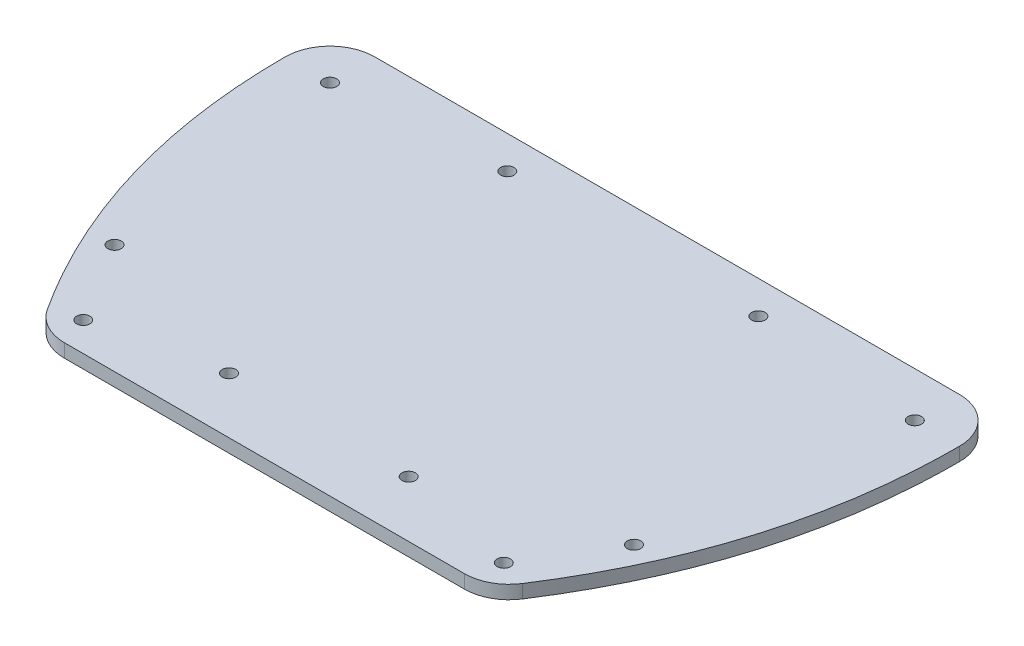
ISO-10303-21;
HEADER;
FILE_DESCRIPTION(('STEP AP214'),'2;1');
FILE_NAME('part.step','',(''),(''),'','','');
FILE_SCHEMA(('AUTOMOTIVE_DESIGN { 1 0 10303 214 1 1 1 1 }'));
ENDSEC;
DATA;
#1=APPLICATION_CONTEXT('core data for automotive mechanical design processes');
#2=APPLICATION_PROTOCOL_DEFINITION('international standard','automotive_design',2000,#1);
#3=PRODUCT_CONTEXT('',#1,'mechanical');
#4=PRODUCT('Part','Part','',(#3));
#5=PRODUCT_RELATED_PRODUCT_CATEGORY('part','',(#4));
#6=PRODUCT_DEFINITION_FORMATION('','',#4);
#7=PRODUCT_DEFINITION_CONTEXT('part definition',#1,'design');
#8=PRODUCT_DEFINITION('design','',#6,#7);
#9=PRODUCT_DEFINITION_SHAPE('','',#8);
#10=(LENGTH_UNIT() NAMED_UNIT(*) SI_UNIT(.MILLI.,.METRE.));
#11=(NAMED_UNIT(*) PLANE_ANGLE_UNIT() SI_UNIT($,.RADIAN.));
#12=(NAMED_UNIT(*) SI_UNIT($,.STERADIAN.) SOLID_ANGLE_UNIT());
#13=UNCERTAINTY_MEASURE_WITH_UNIT(LENGTH_MEASURE(1.E-05),#10,'distance_accuracy_value','');
#14=(GEOMETRIC_REPRESENTATION_CONTEXT(3) GLOBAL_UNCERTAINTY_ASSIGNED_CONTEXT((#13)) GLOBAL_UNIT_ASSIGNED_CONTEXT((#10,
#11,#12)) REPRESENTATION_CONTEXT('',''));
#15=CARTESIAN_POINT('',(0.,0.,0.));
#16=DIRECTION('',(0.,0.,1.));
#17=DIRECTION('',(1.,0.,0.));
#18=AXIS2_PLACEMENT_3D('',#15,#16,#17);
#19=CARTESIAN_POINT('',(-44.6767233784109,3.,80.));
#20=DIRECTION('',(0.,-1.,0.));
#21=DIRECTION('',(0.,0.,-1.));
#22=AXIS2_PLACEMENT_3D('',#19,#20,#21);
#23=CYLINDRICAL_SURFACE('',#22,10.);
#24=CARTESIAN_POINT('',(-44.6767233784109,0.,80.));
#25=DIRECTION('',(0.,1.,0.));
#26=DIRECTION('',(0.,0.,-1.));
#27=AXIS2_PLACEMENT_3D('',#24,#25,#26);
#28=CIRCLE('',#27,10.);
#29=CARTESIAN_POINT('',(-53.072976878323,0.,85.4316597063165));
#30=VERTEX_POINT('',#29);
#31=CARTESIAN_POINT('',(-44.6767233784109,0.,90.));
#32=VERTEX_POINT('',#31);
#33=EDGE_CURVE('E139',#30,#32,#28,.T.);
#34=ORIENTED_EDGE('',*,*,#33,.T.);
#35=DIRECTION('',(0.,-1.,0.));
#36=VECTOR('',#35,1.);
#37=CARTESIAN_POINT('',(-44.6767233784109,3.,90.));
#38=LINE('',#37,#36);
#39=CARTESIAN_POINT('',(-44.6767233784109,3.,90.));
#40=VERTEX_POINT('',#39);
#41=EDGE_CURVE('E11',#40,#32,#38,.T.);
#42=ORIENTED_EDGE('',*,*,#41,.F.);
#43=CARTESIAN_POINT('',(-44.6767233784109,3.,80.));
#44=DIRECTION('',(0.,1.,0.));
#45=DIRECTION('',(0.,0.,-1.));
#46=AXIS2_PLACEMENT_3D('',#43,#44,#45);
#47=CIRCLE('',#46,10.);
#48=CARTESIAN_POINT('',(-53.072976878323,3.,85.4316597063165));
#49=VERTEX_POINT('',#48);
#50=EDGE_CURVE('E176',#49,#40,#47,.T.);
#51=ORIENTED_EDGE('',*,*,#50,.F.);
#52=DIRECTION('',(0.,-1.,0.));
#53=VECTOR('',#52,1.);
#54=CARTESIAN_POINT('',(-53.072976878323,3.,85.4316597063165));
#55=LINE('',#54,#53);
#56=EDGE_CURVE('E132',#49,#30,#55,.T.);
#57=ORIENTED_EDGE('',*,*,#56,.T.);
#58=EDGE_LOOP('',(#34,#42,#51,#57));
#59=FACE_BOUND('',#58,.T.);
#60=ADVANCED_FACE('F38',(#59),#23,.T.);
#61=CARTESIAN_POINT('',(-44.6767233784109,3.,90.));
#62=DIRECTION('',(0.,0.,-1.));
#63=DIRECTION('',(-1.,0.,0.));
#64=AXIS2_PLACEMENT_3D('',#61,#62,#63);
#65=PLANE('',#64);
#66=DIRECTION('',(1.,0.,0.));
#67=VECTOR('',#66,1.);
#68=CARTESIAN_POINT('',(-44.6767233784109,0.,90.));
#69=LINE('',#68,#67);
#70=CARTESIAN_POINT('',(44.6767233784109,0.,90.));
#71=VERTEX_POINT('',#70);
#72=EDGE_CURVE('E273',#32,#71,#69,.T.);
#73=ORIENTED_EDGE('',*,*,#72,.T.);
#74=DIRECTION('',(0.,-1.,0.));
#75=VECTOR('',#74,1.);
#76=CARTESIAN_POINT('',(44.6767233784109,3.,90.));
#77=LINE('',#76,#75);
#78=CARTESIAN_POINT('',(44.6767233784109,3.,90.));
#79=VERTEX_POINT('',#78);
#80=EDGE_CURVE('E47',#79,#71,#77,.T.);
#81=ORIENTED_EDGE('',*,*,#80,.F.);
#82=DIRECTION('',(1.,0.,0.));
#83=VECTOR('',#82,1.);
#84=CARTESIAN_POINT('',(-44.6767233784109,3.,90.));
#85=LINE('',#84,#83);
#86=EDGE_CURVE('E99',#40,#79,#85,.T.);
#87=ORIENTED_EDGE('',*,*,#86,.F.);
#88=ORIENTED_EDGE('',*,*,#41,.T.);
#89=EDGE_LOOP('',(#73,#81,#87,#88));
#90=FACE_BOUND('',#89,.T.);
#91=ADVANCED_FACE('F263',(#90),#65,.F.);
#92=CARTESIAN_POINT('',(44.6767233784109,3.,80.));
#93=DIRECTION('',(0.,-1.,0.));
#94=DIRECTION('',(0.,0.,-1.));
#95=AXIS2_PLACEMENT_3D('',#92,#93,#94);
#96=CYLINDRICAL_SURFACE('',#95,10.);
#97=CARTESIAN_POINT('',(44.6767233784109,0.,80.));
#98=DIRECTION('',(0.,1.,0.));
#99=DIRECTION('',(0.,0.,1.));
#100=AXIS2_PLACEMENT_3D('',#97,#98,#99);
#101=CIRCLE('',#100,10.);
#102=CARTESIAN_POINT('',(53.0729768783235,0.,85.431659706315));
#103=VERTEX_POINT('',#102);
#104=EDGE_CURVE('E274',#71,#103,#101,.T.);
#105=ORIENTED_EDGE('',*,*,#104,.T.);
#106=DIRECTION('',(0.,-1.,0.));
#107=VECTOR('',#106,1.);
#108=CARTESIAN_POINT('',(53.0729768783235,3.,85.431659706315));
#109=LINE('',#108,#107);
#110=CARTESIAN_POINT('',(53.0729768783235,3.,85.431659706315));
#111=VERTEX_POINT('',#110);
#112=EDGE_CURVE('E458',#111,#103,#109,.T.);
#113=ORIENTED_EDGE('',*,*,#112,.F.);
#114=CARTESIAN_POINT('',(44.6767233784109,3.,80.));
#115=DIRECTION('',(0.,1.,0.));
#116=DIRECTION('',(0.,0.,1.));
#117=AXIS2_PLACEMENT_3D('',#114,#115,#116);
#118=CIRCLE('',#117,10.);
#119=EDGE_CURVE('E170',#79,#111,#118,.T.);
#120=ORIENTED_EDGE('',*,*,#119,.F.);
#121=ORIENTED_EDGE('',*,*,#80,.T.);
#122=EDGE_LOOP('',(#105,#113,#120,#121));
#123=FACE_BOUND('',#122,.T.);
#124=ADVANCED_FACE('F163',(#123),#96,.T.);
#125=CARTESIAN_POINT('',(53.072976878323,3.,85.4316597063164));
#126=CARTESIAN_POINT('',(60.5388482083363,3.,73.8909241533057));
#127=CARTESIAN_POINT('',(71.6570879907579,3.,49.894617792491));
#128=CARTESIAN_POINT('',(75.3626299643021,3.,23.5866754163164));
#129=CARTESIAN_POINT('',(75.3419936783559,3.,9.98482833832962));
#130=B_SPLINE_CURVE_WITH_KNOTS('',3,(#125,#126,#127,#128,#129),.UNSPECIFIED.,.F.,.F.,(4,1,4),
(0.101765917421232,0.524100536338746,0.943927147604964),.UNSPECIFIED.);
#131=DIRECTION('',(0.,-1.,0.));
#132=VECTOR('',#131,1.);
#133=SURFACE_OF_LINEAR_EXTRUSION('',#130,#132);
#134=CARTESIAN_POINT('',(53.072976878323,0.,85.4316597063164));
#135=CARTESIAN_POINT('',(60.5388482083363,0.,73.8909241533057));
#136=CARTESIAN_POINT('',(71.6570879907579,0.,49.894617792491));
#137=CARTESIAN_POINT('',(75.3626299643021,0.,23.5866754163164));
#138=CARTESIAN_POINT('',(75.3419936783559,0.,9.98482833832962));
#139=B_SPLINE_CURVE_WITH_KNOTS('',3,(#134,#135,#136,#137,#138),.UNSPECIFIED.,.F.,.F.,(4,1,4),
(0.101765917421232,0.524100536338746,0.943927147604964),.UNSPECIFIED.);
#140=CARTESIAN_POINT('',(75.3419936783559,0.,9.98482833832962));
#141=VERTEX_POINT('',#140);
#142=EDGE_CURVE('E461',#103,#141,#139,.T.);
#143=ORIENTED_EDGE('',*,*,#142,.T.);
#144=DIRECTION('',(0.,-1.,0.));
#145=VECTOR('',#144,1.);
#146=CARTESIAN_POINT('',(75.3419936783559,3.,9.98482833832962));
#147=LINE('',#146,#145);
#148=CARTESIAN_POINT('',(75.3419936783559,3.,9.98482833832962));
#149=VERTEX_POINT('',#148);
#150=EDGE_CURVE('E465',#149,#141,#147,.T.);
#151=ORIENTED_EDGE('',*,*,#150,.F.);
#152=EDGE_CURVE('E165',#111,#149,#130,.T.);
#153=ORIENTED_EDGE('',*,*,#152,.F.);
#154=ORIENTED_EDGE('',*,*,#112,.T.);
#155=EDGE_LOOP('',(#143,#151,#153,#154));
#156=FACE_BOUND('',#155,.T.);
#157=ADVANCED_FACE('F158',(#156),#133,.F.);
#158=CARTESIAN_POINT('',(65.3420051873284,3.,10.));
#159=DIRECTION('',(0.,-1.,0.));
#160=DIRECTION('',(0.,0.,-1.));
#161=AXIS2_PLACEMENT_3D('',#158,#159,#160);
#162=CYLINDRICAL_SURFACE('',#161,10.);
#163=CARTESIAN_POINT('',(65.3420051873284,0.,10.));
#164=DIRECTION('',(0.,1.,0.));
#165=DIRECTION('',(0.,0.,1.));
#166=AXIS2_PLACEMENT_3D('',#163,#164,#165);
#167=CIRCLE('',#166,10.);
#168=CARTESIAN_POINT('',(65.3420051873284,0.,0.));
#169=VERTEX_POINT('',#168);
#170=EDGE_CURVE('E468',#141,#169,#167,.T.);
#171=ORIENTED_EDGE('',*,*,#170,.T.);
#172=DIRECTION('',(0.,-1.,0.));
#173=VECTOR('',#172,1.);
#174=CARTESIAN_POINT('',(65.3420051873284,3.,0.));
#175=LINE('',#174,#173);
#176=CARTESIAN_POINT('',(65.3420051873284,3.,0.));
#177=VERTEX_POINT('',#176);
#178=EDGE_CURVE('E127',#177,#169,#175,.T.);
#179=ORIENTED_EDGE('',*,*,#178,.F.);
#180=CARTESIAN_POINT('',(65.3420051873284,3.,10.));
#181=DIRECTION('',(0.,1.,0.));
#182=DIRECTION('',(0.,0.,1.));
#183=AXIS2_PLACEMENT_3D('',#180,#181,#182);
#184=CIRCLE('',#183,10.);
#185=EDGE_CURVE('E118',#149,#177,#184,.T.);
#186=ORIENTED_EDGE('',*,*,#185,.F.);
#187=ORIENTED_EDGE('',*,*,#150,.T.);
#188=EDGE_LOOP('',(#171,#179,#186,#187));
#189=FACE_BOUND('',#188,.T.);
#190=ADVANCED_FACE('F155',(#189),#162,.T.);
#191=CARTESIAN_POINT('',(-65.3420051873284,3.,0.));
#192=DIRECTION('',(0.,0.,1.));
#193=DIRECTION('',(1.,0.,0.));
#194=AXIS2_PLACEMENT_3D('',#191,#192,#193);
#195=PLANE('',#194);
#196=DIRECTION('',(-1.,0.,0.));
#197=VECTOR('',#196,1.);
#198=CARTESIAN_POINT('',(-65.3420051873284,0.,0.));
#199=LINE('',#198,#197);
#200=CARTESIAN_POINT('',(-65.3420051873284,0.,0.));
#201=VERTEX_POINT('',#200);
#202=EDGE_CURVE('E126',#169,#201,#199,.T.);
#203=ORIENTED_EDGE('',*,*,#202,.T.);
#204=DIRECTION('',(0.,-1.,0.));
#205=VECTOR('',#204,1.);
#206=CARTESIAN_POINT('',(-65.3420051873284,3.,0.));
#207=LINE('',#206,#205);
#208=CARTESIAN_POINT('',(-65.3420051873284,3.,0.));
#209=VERTEX_POINT('',#208);
#210=EDGE_CURVE('E123',#209,#201,#207,.T.);
#211=ORIENTED_EDGE('',*,*,#210,.F.);
#212=DIRECTION('',(-1.,0.,0.));
#213=VECTOR('',#212,1.);
#214=CARTESIAN_POINT('',(-65.3420051873284,3.,0.));
#215=LINE('',#214,#213);
#216=EDGE_CURVE('E112',#177,#209,#215,.T.);
#217=ORIENTED_EDGE('',*,*,#216,.F.);
#218=ORIENTED_EDGE('',*,*,#178,.T.);
#219=EDGE_LOOP('',(#203,#211,#217,#218));
#220=FACE_BOUND('',#219,.T.);
#221=ADVANCED_FACE('F124',(#220),#195,.F.);
#222=CARTESIAN_POINT('',(-65.3420051873284,3.,10.));
#223=DIRECTION('',(0.,-1.,0.));
#224=DIRECTION('',(0.,0.,-1.));
#225=AXIS2_PLACEMENT_3D('',#222,#223,#224);
#226=CYLINDRICAL_SURFACE('',#225,10.);
#227=CARTESIAN_POINT('',(-65.3420051873284,0.,10.));
#228=DIRECTION('',(0.,1.,0.));
#229=DIRECTION('',(0.,0.,1.));
#230=AXIS2_PLACEMENT_3D('',#227,#228,#229);
#231=CIRCLE('',#230,10.);
#232=CARTESIAN_POINT('',(-75.3419936783559,0.,9.98482833832963));
#233=VERTEX_POINT('',#232);
#234=EDGE_CURVE('E85',#201,#233,#231,.T.);
#235=ORIENTED_EDGE('',*,*,#234,.T.);
#236=DIRECTION('',(0.,-1.,0.));
#237=VECTOR('',#236,1.);
#238=CARTESIAN_POINT('',(-75.3419936783559,3.,9.98482833832963));
#239=LINE('',#238,#237);
#240=CARTESIAN_POINT('',(-75.3419936783559,3.,9.98482833832963));
#241=VERTEX_POINT('',#240);
#242=EDGE_CURVE('E128',#241,#233,#239,.T.);
#243=ORIENTED_EDGE('',*,*,#242,.F.);
#244=CARTESIAN_POINT('',(-65.3420051873284,3.,10.));
#245=DIRECTION('',(0.,1.,0.));
#246=DIRECTION('',(0.,0.,1.));
#247=AXIS2_PLACEMENT_3D('',#244,#245,#246);
#248=CIRCLE('',#247,10.);
#249=EDGE_CURVE('E116',#209,#241,#248,.T.);
#250=ORIENTED_EDGE('',*,*,#249,.F.);
#251=ORIENTED_EDGE('',*,*,#210,.T.);
#252=EDGE_LOOP('',(#235,#243,#250,#251));
#253=FACE_BOUND('',#252,.T.);
#254=ADVANCED_FACE('F130',(#253),#226,.T.);
#255=CARTESIAN_POINT('',(-75.3419936783559,3.,9.98482833832963));
#256=CARTESIAN_POINT('',(-75.3626299643021,3.,23.5866754163165));
#257=CARTESIAN_POINT('',(-71.6570879907579,3.,49.894617792491));
#258=CARTESIAN_POINT('',(-60.5388482083363,3.,73.8909241533057));
#259=CARTESIAN_POINT('',(-53.072976878323,3.,85.4316597063165));
#260=B_SPLINE_CURVE_WITH_KNOTS('',3,(#255,#256,#257,#258,#259),.UNSPECIFIED.,.F.,.F.,(4,1,4),
(0.101765917421232,0.52159252868745,0.943927147604964),.UNSPECIFIED.);
#261=DIRECTION('',(0.,-1.,0.));
#262=VECTOR('',#261,1.);
#263=SURFACE_OF_LINEAR_EXTRUSION('',#260,#262);
#264=CARTESIAN_POINT('',(-75.3419936783559,0.,9.98482833832963));
#265=CARTESIAN_POINT('',(-75.3626299643021,0.,23.5866754163165));
#266=CARTESIAN_POINT('',(-71.6570879907579,0.,49.894617792491));
#267=CARTESIAN_POINT('',(-60.5388482083363,0.,73.8909241533057));
#268=CARTESIAN_POINT('',(-53.072976878323,0.,85.4316597063165));
#269=B_SPLINE_CURVE_WITH_KNOTS('',3,(#264,#265,#266,#267,#268),.UNSPECIFIED.,.F.,.F.,(4,1,4),
(0.101765917421232,0.52159252868745,0.943927147604964),.UNSPECIFIED.);
#270=EDGE_CURVE('E91',#233,#30,#269,.T.);
#271=ORIENTED_EDGE('',*,*,#270,.T.);
#272=ORIENTED_EDGE('',*,*,#56,.F.);
#273=EDGE_CURVE('E56',#241,#49,#260,.T.);
#274=ORIENTED_EDGE('',*,*,#273,.F.);
#275=ORIENTED_EDGE('',*,*,#242,.T.);
#276=EDGE_LOOP('',(#271,#272,#274,#275));
#277=FACE_BOUND('',#276,.T.);
#278=ADVANCED_FACE('F145',(#277),#263,.F.);
#279=CARTESIAN_POINT('',(-44.6767233784109,3.,80.));
#280=DIRECTION('',(0.,-1.,0.));
#281=DIRECTION('',(0.,0.,-1.));
#282=AXIS2_PLACEMENT_3D('',#279,#280,#281);
#283=PLANE('',#282);
#284=CARTESIAN_POINT('',(58.0336559710138,3.,65.4582148461571));
#285=DIRECTION('',(0.,1.,0.));
#286=DIRECTION('',(0.,0.,-1.));
#287=AXIS2_PLACEMENT_3D('',#284,#285,#286);
#288=CIRCLE('',#287,1.5);
#289=CARTESIAN_POINT('',(58.0336559710138,3.,63.9582148461571));
#290=VERTEX_POINT('',#289);
#291=EDGE_CURVE('E214',#290,#290,#288,.T.);
#292=ORIENTED_EDGE('',*,*,#291,.F.);
#293=EDGE_LOOP('',(#292));
#294=FACE_BOUND('',#293,.T.);
#295=CARTESIAN_POINT('',(-58.0336559710138,3.,65.4582148461572));
#296=DIRECTION('',(0.,1.,0.));
#297=DIRECTION('',(0.,0.,1.));
#298=AXIS2_PLACEMENT_3D('',#295,#296,#297);
#299=CIRCLE('',#298,1.5);
#300=CARTESIAN_POINT('',(-58.0336559710138,3.,66.9582148461572));
#301=VERTEX_POINT('',#300);
#302=EDGE_CURVE('E208',#301,#301,#299,.T.);
#303=ORIENTED_EDGE('',*,*,#302,.F.);
#304=EDGE_LOOP('',(#303));
#305=FACE_BOUND('',#304,.T.);
#306=CARTESIAN_POINT('',(27.7186465523428,3.,7.34026355255431));
#307=DIRECTION('',(0.,1.,0.));
#308=DIRECTION('',(0.,0.,1.));
#309=AXIS2_PLACEMENT_3D('',#306,#307,#308);
#310=CIRCLE('',#309,1.5);
#311=CARTESIAN_POINT('',(27.7186465523428,3.,8.84026355255432));
#312=VERTEX_POINT('',#311);
#313=EDGE_CURVE('E204',#312,#312,#310,.T.);
#314=ORIENTED_EDGE('',*,*,#313,.F.);
#315=EDGE_LOOP('',(#314));
#316=FACE_BOUND('',#315,.T.);
#317=CARTESIAN_POINT('',(19.6954996347843,3.,77.4620335585409));
#318=DIRECTION('',(0.,1.,0.));
#319=DIRECTION('',(0.,0.,1.));
#320=AXIS2_PLACEMENT_3D('',#317,#318,#319);
#321=CIRCLE('',#320,1.5);
#322=CARTESIAN_POINT('',(19.6954996347843,3.,78.9620335585409));
#323=VERTEX_POINT('',#322);
#324=EDGE_CURVE('E200',#323,#323,#321,.T.);
#325=ORIENTED_EDGE('',*,*,#324,.F.);
#326=EDGE_LOOP('',(#325));
#327=FACE_BOUND('',#326,.T.);
#328=CARTESIAN_POINT('',(-20.3845642951228,3.,77.5219972125791));
#329=DIRECTION('',(0.,1.,0.));
#330=DIRECTION('',(0.,0.,1.));
#331=AXIS2_PLACEMENT_3D('',#328,#329,#330);
#332=CIRCLE('',#331,1.5);
#333=CARTESIAN_POINT('',(-20.3845642951228,3.,79.0219972125791));
#334=VERTEX_POINT('',#333);
#335=EDGE_CURVE('E197',#334,#334,#332,.T.);
#336=ORIENTED_EDGE('',*,*,#335,.F.);
#337=EDGE_LOOP('',(#336));
#338=FACE_BOUND('',#337,.T.);
#339=CARTESIAN_POINT('',(-28.3877748478156,3.,7.34026355255431));
#340=DIRECTION('',(0.,1.,0.));
#341=DIRECTION('',(0.,0.,1.));
#342=AXIS2_PLACEMENT_3D('',#339,#340,#341);
#343=CIRCLE('',#342,1.5);
#344=CARTESIAN_POINT('',(-28.3877748478156,3.,8.84026355255432));
#345=VERTEX_POINT('',#344);
#346=EDGE_CURVE('E194',#345,#345,#343,.T.);
#347=ORIENTED_EDGE('',*,*,#346,.F.);
#348=EDGE_LOOP('',(#347));
#349=FACE_BOUND('',#348,.T.);
#350=CARTESIAN_POINT('',(-46.986453842063,3.,83.4972437555519));
#351=DIRECTION('',(0.,1.,0.));
#352=DIRECTION('',(0.,0.,1.));
#353=AXIS2_PLACEMENT_3D('',#350,#351,#352);
#354=CIRCLE('',#353,1.5);
#355=CARTESIAN_POINT('',(-46.986453842063,3.,84.9972437555519));
#356=VERTEX_POINT('',#355);
#357=EDGE_CURVE('E190',#356,#356,#354,.T.);
#358=ORIENTED_EDGE('',*,*,#357,.F.);
#359=EDGE_LOOP('',(#358));
#360=FACE_BOUND('',#359,.T.);
#361=CARTESIAN_POINT('',(46.986453842063,3.,83.4972437555519));
#362=DIRECTION('',(0.,1.,0.));
#363=DIRECTION('',(0.,0.,-1.));
#364=AXIS2_PLACEMENT_3D('',#361,#362,#363);
#365=CIRCLE('',#364,1.5);
#366=CARTESIAN_POINT('',(46.986453842063,3.,81.9972437555519));
#367=VERTEX_POINT('',#366);
#368=EDGE_CURVE('E186',#367,#367,#365,.T.);
#369=ORIENTED_EDGE('',*,*,#368,.F.);
#370=EDGE_LOOP('',(#369));
#371=FACE_BOUND('',#370,.T.);
#372=CARTESIAN_POINT('',(65.3420051873284,3.,10.));
#373=DIRECTION('',(0.,1.,0.));
#374=DIRECTION('',(0.,0.,-1.));
#375=AXIS2_PLACEMENT_3D('',#372,#373,#374);
#376=CIRCLE('',#375,1.5);
#377=CARTESIAN_POINT('',(65.3420051873284,3.,8.5));
#378=VERTEX_POINT('',#377);
#379=EDGE_CURVE('E183',#378,#378,#376,.T.);
#380=ORIENTED_EDGE('',*,*,#379,.F.);
#381=EDGE_LOOP('',(#380));
#382=FACE_BOUND('',#381,.T.);
#383=CARTESIAN_POINT('',(-65.3420051873284,3.,10.));
#384=DIRECTION('',(0.,1.,0.));
#385=DIRECTION('',(0.,0.,1.));
#386=AXIS2_PLACEMENT_3D('',#383,#384,#385);
#387=CIRCLE('',#386,1.5);
#388=CARTESIAN_POINT('',(-65.3420051873284,3.,11.5));
#389=VERTEX_POINT('',#388);
#390=EDGE_CURVE('E178',#389,#389,#387,.T.);
#391=ORIENTED_EDGE('',*,*,#390,.F.);
#392=EDGE_LOOP('',(#391));
#393=FACE_BOUND('',#392,.T.);
#394=ORIENTED_EDGE('',*,*,#50,.T.);
#395=ORIENTED_EDGE('',*,*,#86,.T.);
#396=ORIENTED_EDGE('',*,*,#119,.T.);
#397=ORIENTED_EDGE('',*,*,#152,.T.);
#398=ORIENTED_EDGE('',*,*,#185,.T.);
#399=ORIENTED_EDGE('',*,*,#216,.T.);
#400=ORIENTED_EDGE('',*,*,#249,.T.);
#401=ORIENTED_EDGE('',*,*,#273,.T.);
#402=EDGE_LOOP('',(#394,#395,#396,#397,#398,#399,#400,#401));
#403=FACE_BOUND('',#402,.T.);
#404=ADVANCED_FACE('F114',(#294,#305,#316,#327,#338,#349,#360,#371,#382,#393,#403),#283,.F.);
#405=CARTESIAN_POINT('',(-44.6767233784109,0.,80.));
#406=DIRECTION('',(0.,-1.,0.));
#407=DIRECTION('',(0.,0.,-1.));
#408=AXIS2_PLACEMENT_3D('',#405,#406,#407);
#409=PLANE('',#408);
#410=CARTESIAN_POINT('',(58.0336559710138,0.,65.4582148461571));
#411=DIRECTION('',(0.,1.,0.));
#412=DIRECTION('',(0.,0.,-1.));
#413=AXIS2_PLACEMENT_3D('',#410,#411,#412);
#414=CIRCLE('',#413,1.5);
#415=CARTESIAN_POINT('',(58.0336559710138,0.,63.9582148461571));
#416=VERTEX_POINT('',#415);
#417=EDGE_CURVE('E211',#416,#416,#414,.T.);
#418=ORIENTED_EDGE('',*,*,#417,.T.);
#419=EDGE_LOOP('',(#418));
#420=FACE_BOUND('',#419,.T.);
#421=CARTESIAN_POINT('',(-58.0336559710138,0.,65.4582148461572));
#422=DIRECTION('',(0.,1.,0.));
#423=DIRECTION('',(0.,0.,1.));
#424=AXIS2_PLACEMENT_3D('',#421,#422,#423);
#425=CIRCLE('',#424,1.5);
#426=CARTESIAN_POINT('',(-58.0336559710138,0.,66.9582148461572));
#427=VERTEX_POINT('',#426);
#428=EDGE_CURVE('E201',#427,#427,#425,.T.);
#429=ORIENTED_EDGE('',*,*,#428,.T.);
#430=EDGE_LOOP('',(#429));
#431=FACE_BOUND('',#430,.T.);
#432=CARTESIAN_POINT('',(27.7186465523428,0.,7.34026355255431));
#433=DIRECTION('',(0.,-1.,0.));
#434=DIRECTION('',(0.,0.,-1.));
#435=AXIS2_PLACEMENT_3D('',#432,#433,#434);
#436=CIRCLE('',#435,1.5);
#437=CARTESIAN_POINT('',(27.7186465523428,0.,5.84026355255431));
#438=VERTEX_POINT('',#437);
#439=EDGE_CURVE('E41',#438,#438,#436,.T.);
#440=ORIENTED_EDGE('',*,*,#439,.F.);
#441=EDGE_LOOP('',(#440));
#442=FACE_BOUND('',#441,.T.);
#443=CARTESIAN_POINT('',(19.6954996347843,0.,77.4620335585409));
#444=DIRECTION('',(0.,-1.,0.));
#445=DIRECTION('',(0.,0.,-1.));
#446=AXIS2_PLACEMENT_3D('',#443,#444,#445);
#447=CIRCLE('',#446,1.5);
#448=CARTESIAN_POINT('',(19.6954996347843,0.,75.9620335585409));
#449=VERTEX_POINT('',#448);
#450=EDGE_CURVE('E289',#449,#449,#447,.T.);
#451=ORIENTED_EDGE('',*,*,#450,.F.);
#452=EDGE_LOOP('',(#451));
#453=FACE_BOUND('',#452,.T.);
#454=CARTESIAN_POINT('',(-20.3845642951228,0.,77.5219972125791));
#455=DIRECTION('',(0.,-1.,0.));
#456=DIRECTION('',(0.,0.,-1.));
#457=AXIS2_PLACEMENT_3D('',#454,#455,#456);
#458=CIRCLE('',#457,1.5);
#459=CARTESIAN_POINT('',(-20.3845642951228,0.,76.0219972125791));
#460=VERTEX_POINT('',#459);
#461=EDGE_CURVE('E207',#460,#460,#458,.T.);
#462=ORIENTED_EDGE('',*,*,#461,.F.);
#463=EDGE_LOOP('',(#462));
#464=FACE_BOUND('',#463,.T.);
#465=CARTESIAN_POINT('',(-28.3877748478156,0.,7.34026355255431));
#466=DIRECTION('',(0.,-1.,0.));
#467=DIRECTION('',(0.,0.,-1.));
#468=AXIS2_PLACEMENT_3D('',#465,#466,#467);
#469=CIRCLE('',#468,1.5);
#470=CARTESIAN_POINT('',(-28.3877748478156,0.,5.84026355255431));
#471=VERTEX_POINT('',#470);
#472=EDGE_CURVE('E187',#471,#471,#469,.T.);
#473=ORIENTED_EDGE('',*,*,#472,.F.);
#474=EDGE_LOOP('',(#473));
#475=FACE_BOUND('',#474,.T.);
#476=CARTESIAN_POINT('',(-46.986453842063,0.,83.4972437555519));
#477=DIRECTION('',(0.,-1.,0.));
#478=DIRECTION('',(0.,0.,-1.));
#479=AXIS2_PLACEMENT_3D('',#476,#477,#478);
#480=CIRCLE('',#479,1.5);
#481=CARTESIAN_POINT('',(-46.986453842063,0.,81.9972437555519));
#482=VERTEX_POINT('',#481);
#483=EDGE_CURVE('E182',#482,#482,#480,.T.);
#484=ORIENTED_EDGE('',*,*,#483,.F.);
#485=EDGE_LOOP('',(#484));
#486=FACE_BOUND('',#485,.T.);
#487=CARTESIAN_POINT('',(46.986453842063,0.,83.4972437555519));
#488=DIRECTION('',(0.,-1.,0.));
#489=DIRECTION('',(0.,0.,-1.));
#490=AXIS2_PLACEMENT_3D('',#487,#488,#489);
#491=CIRCLE('',#490,1.5);
#492=CARTESIAN_POINT('',(46.986453842063,0.,81.9972437555519));
#493=VERTEX_POINT('',#492);
#494=EDGE_CURVE('E281',#493,#493,#491,.T.);
#495=ORIENTED_EDGE('',*,*,#494,.F.);
#496=EDGE_LOOP('',(#495));
#497=FACE_BOUND('',#496,.T.);
#498=CARTESIAN_POINT('',(65.3420051873284,0.,10.));
#499=DIRECTION('',(0.,-1.,0.));
#500=DIRECTION('',(0.,0.,-1.));
#501=AXIS2_PLACEMENT_3D('',#498,#499,#500);
#502=CIRCLE('',#501,1.5);
#503=CARTESIAN_POINT('',(65.3420051873284,0.,8.5));
#504=VERTEX_POINT('',#503);
#505=EDGE_CURVE('E193',#504,#504,#502,.T.);
#506=ORIENTED_EDGE('',*,*,#505,.F.);
#507=EDGE_LOOP('',(#506));
#508=FACE_BOUND('',#507,.T.);
#509=CARTESIAN_POINT('',(-65.3420051873284,0.,10.));
#510=DIRECTION('',(0.,-1.,0.));
#511=DIRECTION('',(0.,0.,-1.));
#512=AXIS2_PLACEMENT_3D('',#509,#510,#511);
#513=CIRCLE('',#512,1.5);
#514=CARTESIAN_POINT('',(-65.3420051873284,0.,8.5));
#515=VERTEX_POINT('',#514);
#516=EDGE_CURVE('E181',#515,#515,#513,.T.);
#517=ORIENTED_EDGE('',*,*,#516,.F.);
#518=EDGE_LOOP('',(#517));
#519=FACE_BOUND('',#518,.T.);
#520=ORIENTED_EDGE('',*,*,#33,.F.);
#521=ORIENTED_EDGE('',*,*,#270,.F.);
#522=ORIENTED_EDGE('',*,*,#234,.F.);
#523=ORIENTED_EDGE('',*,*,#202,.F.);
#524=ORIENTED_EDGE('',*,*,#170,.F.);
#525=ORIENTED_EDGE('',*,*,#142,.F.);
#526=ORIENTED_EDGE('',*,*,#104,.F.);
#527=ORIENTED_EDGE('',*,*,#72,.F.);
#528=EDGE_LOOP('',(#520,#521,#522,#523,#524,#525,#526,#527));
#529=FACE_BOUND('',#528,.T.);
#530=ADVANCED_FACE('F149',(#420,#431,#442,#453,#464,#475,#486,#497,#508,#519,#529),#409,.T.);
#531=CARTESIAN_POINT('',(-65.3420051873284,-7.,10.));
#532=DIRECTION('',(0.,1.,0.));
#533=DIRECTION('',(0.,0.,1.));
#534=AXIS2_PLACEMENT_3D('',#531,#532,#533);
#535=CYLINDRICAL_SURFACE('',#534,1.5);
#536=ORIENTED_EDGE('',*,*,#516,.T.);
#537=EDGE_LOOP('',(#536));
#538=FACE_BOUND('',#537,.T.);
#539=ORIENTED_EDGE('',*,*,#390,.T.);
#540=EDGE_LOOP('',(#539));
#541=FACE_BOUND('',#540,.T.);
#542=ADVANCED_FACE('F249',(#538,#541),#535,.F.);
#543=CARTESIAN_POINT('',(65.3420051873284,-7.,10.));
#544=DIRECTION('',(0.,1.,0.));
#545=DIRECTION('',(0.,0.,1.));
#546=AXIS2_PLACEMENT_3D('',#543,#544,#545);
#547=CYLINDRICAL_SURFACE('',#546,1.5);
#548=ORIENTED_EDGE('',*,*,#505,.T.);
#549=EDGE_LOOP('',(#548));
#550=FACE_BOUND('',#549,.T.);
#551=ORIENTED_EDGE('',*,*,#379,.T.);
#552=EDGE_LOOP('',(#551));
#553=FACE_BOUND('',#552,.T.);
#554=ADVANCED_FACE('F251',(#550,#553),#547,.F.);
#555=CARTESIAN_POINT('',(46.986453842063,-7.,83.4972437555519));
#556=DIRECTION('',(0.,1.,0.));
#557=DIRECTION('',(0.,0.,1.));
#558=AXIS2_PLACEMENT_3D('',#555,#556,#557);
#559=CYLINDRICAL_SURFACE('',#558,1.5);
#560=ORIENTED_EDGE('',*,*,#494,.T.);
#561=EDGE_LOOP('',(#560));
#562=FACE_BOUND('',#561,.T.);
#563=ORIENTED_EDGE('',*,*,#368,.T.);
#564=EDGE_LOOP('',(#563));
#565=FACE_BOUND('',#564,.T.);
#566=ADVANCED_FACE('F258',(#562,#565),#559,.F.);
#567=CARTESIAN_POINT('',(-46.986453842063,-7.,83.4972437555519));
#568=DIRECTION('',(0.,1.,0.));
#569=DIRECTION('',(0.,0.,1.));
#570=AXIS2_PLACEMENT_3D('',#567,#568,#569);
#571=CYLINDRICAL_SURFACE('',#570,1.5);
#572=ORIENTED_EDGE('',*,*,#483,.T.);
#573=EDGE_LOOP('',(#572));
#574=FACE_BOUND('',#573,.T.);
#575=ORIENTED_EDGE('',*,*,#357,.T.);
#576=EDGE_LOOP('',(#575));
#577=FACE_BOUND('',#576,.T.);
#578=ADVANCED_FACE('F315',(#574,#577),#571,.F.);
#579=CARTESIAN_POINT('',(-28.3877748478156,-7.,7.34026355255431));
#580=DIRECTION('',(0.,1.,0.));
#581=DIRECTION('',(0.,0.,1.));
#582=AXIS2_PLACEMENT_3D('',#579,#580,#581);
#583=CYLINDRICAL_SURFACE('',#582,1.5);
#584=ORIENTED_EDGE('',*,*,#472,.T.);
#585=EDGE_LOOP('',(#584));
#586=FACE_BOUND('',#585,.T.);
#587=ORIENTED_EDGE('',*,*,#346,.T.);
#588=EDGE_LOOP('',(#587));
#589=FACE_BOUND('',#588,.T.);
#590=ADVANCED_FACE('F320',(#586,#589),#583,.F.);
#591=CARTESIAN_POINT('',(-20.3845642951228,-7.,77.5219972125791));
#592=DIRECTION('',(0.,1.,0.));
#593=DIRECTION('',(0.,0.,1.));
#594=AXIS2_PLACEMENT_3D('',#591,#592,#593);
#595=CYLINDRICAL_SURFACE('',#594,1.5);
#596=ORIENTED_EDGE('',*,*,#461,.T.);
#597=EDGE_LOOP('',(#596));
#598=FACE_BOUND('',#597,.T.);
#599=ORIENTED_EDGE('',*,*,#335,.T.);
#600=EDGE_LOOP('',(#599));
#601=FACE_BOUND('',#600,.T.);
#602=ADVANCED_FACE('F326',(#598,#601),#595,.F.);
#603=CARTESIAN_POINT('',(19.6954996347843,-7.,77.4620335585409));
#604=DIRECTION('',(0.,1.,0.));
#605=DIRECTION('',(0.,0.,1.));
#606=AXIS2_PLACEMENT_3D('',#603,#604,#605);
#607=CYLINDRICAL_SURFACE('',#606,1.5);
#608=ORIENTED_EDGE('',*,*,#450,.T.);
#609=EDGE_LOOP('',(#608));
#610=FACE_BOUND('',#609,.T.);
#611=ORIENTED_EDGE('',*,*,#324,.T.);
#612=EDGE_LOOP('',(#611));
#613=FACE_BOUND('',#612,.T.);
#614=ADVANCED_FACE('F330',(#610,#613),#607,.F.);
#615=CARTESIAN_POINT('',(27.7186465523428,-7.,7.34026355255431));
#616=DIRECTION('',(0.,1.,0.));
#617=DIRECTION('',(0.,0.,1.));
#618=AXIS2_PLACEMENT_3D('',#615,#616,#617);
#619=CYLINDRICAL_SURFACE('',#618,1.5);
#620=ORIENTED_EDGE('',*,*,#439,.T.);
#621=EDGE_LOOP('',(#620));
#622=FACE_BOUND('',#621,.T.);
#623=ORIENTED_EDGE('',*,*,#313,.T.);
#624=EDGE_LOOP('',(#623));
#625=FACE_BOUND('',#624,.T.);
#626=ADVANCED_FACE('F296',(#622,#625),#619,.F.);
#627=CARTESIAN_POINT('',(-58.0336559710138,0.,65.4582148461572));
#628=DIRECTION('',(0.,1.,0.));
#629=DIRECTION('',(0.,0.,1.));
#630=AXIS2_PLACEMENT_3D('',#627,#628,#629);
#631=CYLINDRICAL_SURFACE('',#630,1.5);
#632=ORIENTED_EDGE('',*,*,#428,.F.);
#633=EDGE_LOOP('',(#632));
#634=FACE_BOUND('',#633,.T.);
#635=ORIENTED_EDGE('',*,*,#302,.T.);
#636=EDGE_LOOP('',(#635));
#637=FACE_BOUND('',#636,.T.);
#638=ADVANCED_FACE('F225',(#634,#637),#631,.F.);
#639=CARTESIAN_POINT('',(58.0336559710138,0.,65.4582148461571));
#640=DIRECTION('',(0.,1.,0.));
#641=DIRECTION('',(0.,0.,1.));
#642=AXIS2_PLACEMENT_3D('',#639,#640,#641);
#643=CYLINDRICAL_SURFACE('',#642,1.5);
#644=ORIENTED_EDGE('',*,*,#417,.F.);
#645=EDGE_LOOP('',(#644));
#646=FACE_BOUND('',#645,.T.);
#647=ORIENTED_EDGE('',*,*,#291,.T.);
#648=EDGE_LOOP('',(#647));
#649=FACE_BOUND('',#648,.T.);
#650=ADVANCED_FACE('F222',(#646,#649),#643,.F.);
#651=CLOSED_SHELL('',(#60,#91,#124,#157,#190,#221,#254,#278,#404,#530,#542,#554,#566,#578,#590,
#602,#614,#626,#638,#650));
#652=MANIFOLD_SOLID_BREP('B2',#651);
#653=ADVANCED_BREP_SHAPE_REPRESENTATION('',(#18,#652),#14);
#654=SHAPE_DEFINITION_REPRESENTATION(#9,#653);
ENDSEC;
END-ISO-10303-21;
